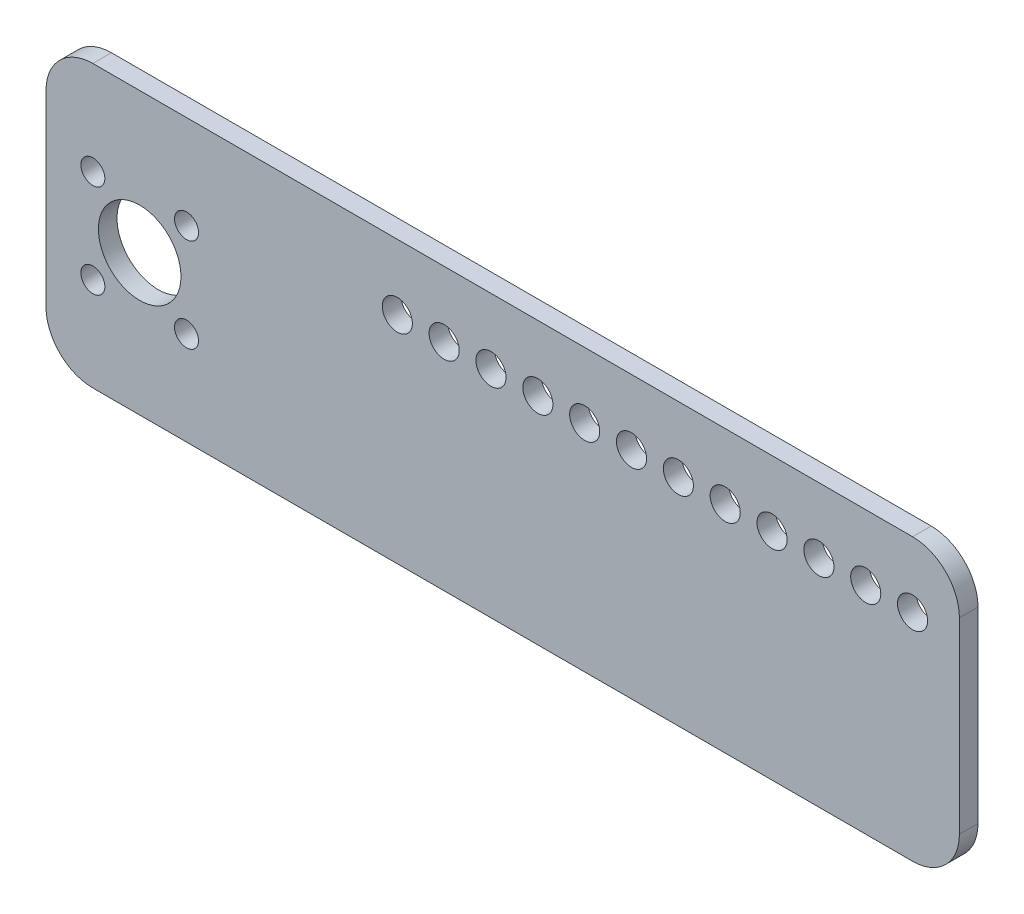
ISO-10303-21;
HEADER;
FILE_DESCRIPTION(('STEP AP214'),'2;1');
FILE_NAME('part.step','',(''),(''),'','','');
FILE_SCHEMA(('AUTOMOTIVE_DESIGN { 1 0 10303 214 1 1 1 1 }'));
ENDSEC;
DATA;
#1=APPLICATION_CONTEXT('core data for automotive mechanical design processes');
#2=APPLICATION_PROTOCOL_DEFINITION('international standard','automotive_design',2000,#1);
#3=PRODUCT_CONTEXT('',#1,'mechanical');
#4=PRODUCT('Part','Part','',(#3));
#5=PRODUCT_RELATED_PRODUCT_CATEGORY('part','',(#4));
#6=PRODUCT_DEFINITION_FORMATION('','',#4);
#7=PRODUCT_DEFINITION_CONTEXT('part definition',#1,'design');
#8=PRODUCT_DEFINITION('design','',#6,#7);
#9=PRODUCT_DEFINITION_SHAPE('','',#8);
#10=(LENGTH_UNIT() NAMED_UNIT(*) SI_UNIT(.MILLI.,.METRE.));
#11=(NAMED_UNIT(*) PLANE_ANGLE_UNIT() SI_UNIT($,.RADIAN.));
#12=(NAMED_UNIT(*) SI_UNIT($,.STERADIAN.) SOLID_ANGLE_UNIT());
#13=UNCERTAINTY_MEASURE_WITH_UNIT(LENGTH_MEASURE(1.E-05),#10,'distance_accuracy_value','');
#14=(GEOMETRIC_REPRESENTATION_CONTEXT(3) GLOBAL_UNCERTAINTY_ASSIGNED_CONTEXT((#13)) GLOBAL_UNIT_ASSIGNED_CONTEXT((#10,
#11,#12)) REPRESENTATION_CONTEXT('',''));
#15=CARTESIAN_POINT('',(0.,0.,0.));
#16=DIRECTION('',(0.,0.,1.));
#17=DIRECTION('',(1.,0.,0.));
#18=AXIS2_PLACEMENT_3D('',#15,#16,#17);
#19=CARTESIAN_POINT('',(0.,24.,3.175));
#20=DIRECTION('',(0.,-1.,0.));
#21=DIRECTION('',(1.,0.,0.));
#22=AXIS2_PLACEMENT_3D('',#19,#20,#21);
#23=PLANE('',#22);
#24=DIRECTION('',(-1.,0.,0.));
#25=VECTOR('',#24,1.);
#26=CARTESIAN_POINT('',(0.,24.,3.175));
#27=LINE('',#26,#25);
#28=CARTESIAN_POINT('',(70.,24.,3.175));
#29=VERTEX_POINT('',#28);
#30=CARTESIAN_POINT('',(-70.,24.,3.175));
#31=VERTEX_POINT('',#30);
#32=EDGE_CURVE('E230',#29,#31,#27,.T.);
#33=ORIENTED_EDGE('',*,*,#32,.F.);
#34=DIRECTION('',(0.,0.,-1.));
#35=VECTOR('',#34,1.);
#36=CARTESIAN_POINT('',(70.,24.,0.));
#37=LINE('',#36,#35);
#38=CARTESIAN_POINT('',(70.,24.,0.));
#39=VERTEX_POINT('',#38);
#40=EDGE_CURVE('E153',#29,#39,#37,.T.);
#41=ORIENTED_EDGE('',*,*,#40,.T.);
#42=DIRECTION('',(-1.,0.,0.));
#43=VECTOR('',#42,1.);
#44=CARTESIAN_POINT('',(0.,24.,0.));
#45=LINE('',#44,#43);
#46=CARTESIAN_POINT('',(-70.,24.,0.));
#47=VERTEX_POINT('',#46);
#48=EDGE_CURVE('E107',#39,#47,#45,.T.);
#49=ORIENTED_EDGE('',*,*,#48,.T.);
#50=DIRECTION('',(0.,0.,-1.));
#51=VECTOR('',#50,1.);
#52=CARTESIAN_POINT('',(-70.,24.,3.175));
#53=LINE('',#52,#51);
#54=EDGE_CURVE('E151',#47,#31,#53,.F.);
#55=ORIENTED_EDGE('',*,*,#54,.T.);
#56=EDGE_LOOP('',(#33,#41,#49,#55));
#57=FACE_BOUND('',#56,.T.);
#58=ADVANCED_FACE('F35',(#57),#23,.F.);
#59=CARTESIAN_POINT('',(-78.,0.,3.175));
#60=DIRECTION('',(1.,0.,0.));
#61=DIRECTION('',(0.,1.,0.));
#62=AXIS2_PLACEMENT_3D('',#59,#60,#61);
#63=PLANE('',#62);
#64=DIRECTION('',(0.,-1.,0.));
#65=VECTOR('',#64,1.);
#66=CARTESIAN_POINT('',(-78.,0.,0.));
#67=LINE('',#66,#65);
#68=CARTESIAN_POINT('',(-78.,16.,0.));
#69=VERTEX_POINT('',#68);
#70=CARTESIAN_POINT('',(-78.,-16.,0.));
#71=VERTEX_POINT('',#70);
#72=EDGE_CURVE('E214',#69,#71,#67,.T.);
#73=ORIENTED_EDGE('',*,*,#72,.T.);
#74=DIRECTION('',(0.,0.,-1.));
#75=VECTOR('',#74,1.);
#76=CARTESIAN_POINT('',(-78.,-16.,3.175));
#77=LINE('',#76,#75);
#78=CARTESIAN_POINT('',(-78.,-16.,3.175));
#79=VERTEX_POINT('',#78);
#80=EDGE_CURVE('E11',#71,#79,#77,.F.);
#81=ORIENTED_EDGE('',*,*,#80,.T.);
#82=DIRECTION('',(0.,-1.,0.));
#83=VECTOR('',#82,1.);
#84=CARTESIAN_POINT('',(-78.,0.,3.175));
#85=LINE('',#84,#83);
#86=CARTESIAN_POINT('',(-78.,16.,3.175));
#87=VERTEX_POINT('',#86);
#88=EDGE_CURVE('E229',#87,#79,#85,.T.);
#89=ORIENTED_EDGE('',*,*,#88,.F.);
#90=DIRECTION('',(0.,0.,-1.));
#91=VECTOR('',#90,1.);
#92=CARTESIAN_POINT('',(-78.,16.,3.175));
#93=LINE('',#92,#91);
#94=EDGE_CURVE('E44',#87,#69,#93,.T.);
#95=ORIENTED_EDGE('',*,*,#94,.T.);
#96=EDGE_LOOP('',(#73,#81,#89,#95));
#97=FACE_BOUND('',#96,.T.);
#98=ADVANCED_FACE('F337',(#97),#63,.F.);
#99=CARTESIAN_POINT('',(0.,-24.,3.175));
#100=DIRECTION('',(0.,-1.,0.));
#101=DIRECTION('',(1.,0.,0.));
#102=AXIS2_PLACEMENT_3D('',#99,#100,#101);
#103=PLANE('',#102);
#104=DIRECTION('',(-1.,0.,0.));
#105=VECTOR('',#104,1.);
#106=CARTESIAN_POINT('',(0.,-24.,0.));
#107=LINE('',#106,#105);
#108=CARTESIAN_POINT('',(70.,-24.,0.));
#109=VERTEX_POINT('',#108);
#110=CARTESIAN_POINT('',(-70.,-24.,0.));
#111=VERTEX_POINT('',#110);
#112=EDGE_CURVE('E124',#109,#111,#107,.T.);
#113=ORIENTED_EDGE('',*,*,#112,.F.);
#114=DIRECTION('',(0.,0.,-1.));
#115=VECTOR('',#114,1.);
#116=CARTESIAN_POINT('',(70.,-24.,3.175));
#117=LINE('',#116,#115);
#118=CARTESIAN_POINT('',(70.,-24.,3.175));
#119=VERTEX_POINT('',#118);
#120=EDGE_CURVE('E143',#109,#119,#117,.F.);
#121=ORIENTED_EDGE('',*,*,#120,.T.);
#122=DIRECTION('',(-1.,0.,0.));
#123=VECTOR('',#122,1.);
#124=CARTESIAN_POINT('',(0.,-24.,3.175));
#125=LINE('',#124,#123);
#126=CARTESIAN_POINT('',(-70.,-24.,3.175));
#127=VERTEX_POINT('',#126);
#128=EDGE_CURVE('E133',#119,#127,#125,.T.);
#129=ORIENTED_EDGE('',*,*,#128,.T.);
#130=DIRECTION('',(0.,0.,-1.));
#131=VECTOR('',#130,1.);
#132=CARTESIAN_POINT('',(-70.,-24.,0.));
#133=LINE('',#132,#131);
#134=EDGE_CURVE('E140',#127,#111,#133,.T.);
#135=ORIENTED_EDGE('',*,*,#134,.T.);
#136=EDGE_LOOP('',(#113,#121,#129,#135));
#137=FACE_BOUND('',#136,.T.);
#138=ADVANCED_FACE('F220',(#137),#103,.T.);
#139=CARTESIAN_POINT('',(-69.9999999999337,7.99999999999999,3.175));
#140=DIRECTION('',(0.,0.,-1.));
#141=DIRECTION('',(-1.,0.,0.));
#142=AXIS2_PLACEMENT_3D('',#139,#140,#141);
#143=CYLINDRICAL_SURFACE('',#142,2.04999999999999);
#144=CARTESIAN_POINT('',(-69.9999999999337,7.99999999999999,3.175));
#145=DIRECTION('',(0.,0.,1.));
#146=DIRECTION('',(1.,0.,0.));
#147=AXIS2_PLACEMENT_3D('',#144,#145,#146);
#148=CIRCLE('',#147,2.04999999999999);
#149=CARTESIAN_POINT('',(-67.9499999999337,7.99999999999999,3.175));
#150=VERTEX_POINT('',#149);
#151=EDGE_CURVE('E234',#150,#150,#148,.T.);
#152=ORIENTED_EDGE('',*,*,#151,.T.);
#153=EDGE_LOOP('',(#152));
#154=FACE_BOUND('',#153,.T.);
#155=CARTESIAN_POINT('',(-69.9999999999337,7.99999999999999,0.));
#156=DIRECTION('',(0.,0.,1.));
#157=DIRECTION('',(1.,0.,0.));
#158=AXIS2_PLACEMENT_3D('',#155,#156,#157);
#159=CIRCLE('',#158,2.04999999999999);
#160=CARTESIAN_POINT('',(-67.9499999999337,7.99999999999999,0.));
#161=VERTEX_POINT('',#160);
#162=EDGE_CURVE('E210',#161,#161,#159,.T.);
#163=ORIENTED_EDGE('',*,*,#162,.F.);
#164=EDGE_LOOP('',(#163));
#165=FACE_BOUND('',#164,.T.);
#166=ADVANCED_FACE('F322',(#154,#165),#143,.F.);
#167=CARTESIAN_POINT('',(-53.9999999999337,7.99999999999999,3.175));
#168=DIRECTION('',(0.,0.,-1.));
#169=DIRECTION('',(-1.,0.,0.));
#170=AXIS2_PLACEMENT_3D('',#167,#168,#169);
#171=CYLINDRICAL_SURFACE('',#170,2.04999999999999);
#172=CARTESIAN_POINT('',(-53.9999999999337,7.99999999999999,3.175));
#173=DIRECTION('',(0.,0.,1.));
#174=DIRECTION('',(1.,0.,0.));
#175=AXIS2_PLACEMENT_3D('',#172,#173,#174);
#176=CIRCLE('',#175,2.04999999999999);
#177=CARTESIAN_POINT('',(-51.9499999999337,7.99999999999999,3.175));
#178=VERTEX_POINT('',#177);
#179=EDGE_CURVE('E237',#178,#178,#176,.T.);
#180=ORIENTED_EDGE('',*,*,#179,.T.);
#181=EDGE_LOOP('',(#180));
#182=FACE_BOUND('',#181,.T.);
#183=CARTESIAN_POINT('',(-53.9999999999337,7.99999999999999,0.));
#184=DIRECTION('',(0.,0.,1.));
#185=DIRECTION('',(1.,0.,0.));
#186=AXIS2_PLACEMENT_3D('',#183,#184,#185);
#187=CIRCLE('',#186,2.04999999999999);
#188=CARTESIAN_POINT('',(-51.9499999999337,7.99999999999999,0.));
#189=VERTEX_POINT('',#188);
#190=EDGE_CURVE('E207',#189,#189,#187,.T.);
#191=ORIENTED_EDGE('',*,*,#190,.F.);
#192=EDGE_LOOP('',(#191));
#193=FACE_BOUND('',#192,.T.);
#194=ADVANCED_FACE('F325',(#182,#193),#171,.F.);
#195=CARTESIAN_POINT('',(-53.9999999999337,-8.00000000000001,3.175));
#196=DIRECTION('',(0.,0.,-1.));
#197=DIRECTION('',(-1.,0.,0.));
#198=AXIS2_PLACEMENT_3D('',#195,#196,#197);
#199=CYLINDRICAL_SURFACE('',#198,2.04999999999999);
#200=CARTESIAN_POINT('',(-53.9999999999337,-8.00000000000001,3.175));
#201=DIRECTION('',(0.,0.,1.));
#202=DIRECTION('',(1.,0.,0.));
#203=AXIS2_PLACEMENT_3D('',#200,#201,#202);
#204=CIRCLE('',#203,2.04999999999999);
#205=CARTESIAN_POINT('',(-51.9499999999337,-8.00000000000001,3.175));
#206=VERTEX_POINT('',#205);
#207=EDGE_CURVE('E240',#206,#206,#204,.T.);
#208=ORIENTED_EDGE('',*,*,#207,.T.);
#209=EDGE_LOOP('',(#208));
#210=FACE_BOUND('',#209,.T.);
#211=CARTESIAN_POINT('',(-53.9999999999337,-8.00000000000001,0.));
#212=DIRECTION('',(0.,0.,1.));
#213=DIRECTION('',(1.,0.,0.));
#214=AXIS2_PLACEMENT_3D('',#211,#212,#213);
#215=CIRCLE('',#214,2.04999999999999);
#216=CARTESIAN_POINT('',(-51.9499999999337,-8.00000000000001,0.));
#217=VERTEX_POINT('',#216);
#218=EDGE_CURVE('E201',#217,#217,#215,.T.);
#219=ORIENTED_EDGE('',*,*,#218,.F.);
#220=EDGE_LOOP('',(#219));
#221=FACE_BOUND('',#220,.T.);
#222=ADVANCED_FACE('F349',(#210,#221),#199,.F.);
#223=CARTESIAN_POINT('',(-69.9999999999337,-8.00000000000001,3.175));
#224=DIRECTION('',(0.,0.,-1.));
#225=DIRECTION('',(-1.,0.,0.));
#226=AXIS2_PLACEMENT_3D('',#223,#224,#225);
#227=CYLINDRICAL_SURFACE('',#226,2.04999999999999);
#228=CARTESIAN_POINT('',(-69.9999999999337,-8.00000000000001,3.175));
#229=DIRECTION('',(0.,0.,1.));
#230=DIRECTION('',(1.,0.,0.));
#231=AXIS2_PLACEMENT_3D('',#228,#229,#230);
#232=CIRCLE('',#231,2.04999999999999);
#233=CARTESIAN_POINT('',(-67.9499999999337,-8.00000000000001,3.175));
#234=VERTEX_POINT('',#233);
#235=EDGE_CURVE('E243',#234,#234,#232,.T.);
#236=ORIENTED_EDGE('',*,*,#235,.T.);
#237=EDGE_LOOP('',(#236));
#238=FACE_BOUND('',#237,.T.);
#239=CARTESIAN_POINT('',(-69.9999999999337,-8.00000000000001,0.));
#240=DIRECTION('',(0.,0.,1.));
#241=DIRECTION('',(1.,0.,0.));
#242=AXIS2_PLACEMENT_3D('',#239,#240,#241);
#243=CIRCLE('',#242,2.04999999999999);
#244=CARTESIAN_POINT('',(-67.9499999999337,-8.00000000000001,0.));
#245=VERTEX_POINT('',#244);
#246=EDGE_CURVE('E196',#245,#245,#243,.T.);
#247=ORIENTED_EDGE('',*,*,#246,.F.);
#248=EDGE_LOOP('',(#247));
#249=FACE_BOUND('',#248,.T.);
#250=ADVANCED_FACE('F353',(#238,#249),#227,.F.);
#251=CARTESIAN_POINT('',(-61.9999999999337,0.,3.175));
#252=DIRECTION('',(0.,0.,-1.));
#253=DIRECTION('',(-1.,0.,0.));
#254=AXIS2_PLACEMENT_3D('',#251,#252,#253);
#255=CYLINDRICAL_SURFACE('',#254,7.05);
#256=CARTESIAN_POINT('',(-61.9999999999337,0.,3.175));
#257=DIRECTION('',(0.,0.,1.));
#258=DIRECTION('',(1.,0.,0.));
#259=AXIS2_PLACEMENT_3D('',#256,#257,#258);
#260=CIRCLE('',#259,7.05);
#261=CARTESIAN_POINT('',(-54.9499999999337,0.,3.175));
#262=VERTEX_POINT('',#261);
#263=EDGE_CURVE('E123',#262,#262,#260,.T.);
#264=ORIENTED_EDGE('',*,*,#263,.T.);
#265=EDGE_LOOP('',(#264));
#266=FACE_BOUND('',#265,.T.);
#267=CARTESIAN_POINT('',(-61.9999999999337,0.,0.));
#268=DIRECTION('',(0.,0.,1.));
#269=DIRECTION('',(1.,0.,0.));
#270=AXIS2_PLACEMENT_3D('',#267,#268,#269);
#271=CIRCLE('',#270,7.05);
#272=CARTESIAN_POINT('',(-54.9499999999337,0.,0.));
#273=VERTEX_POINT('',#272);
#274=EDGE_CURVE('E192',#273,#273,#271,.T.);
#275=ORIENTED_EDGE('',*,*,#274,.F.);
#276=EDGE_LOOP('',(#275));
#277=FACE_BOUND('',#276,.T.);
#278=ADVANCED_FACE('F357',(#266,#277),#255,.F.);
#279=CARTESIAN_POINT('',(78.,0.,3.175));
#280=DIRECTION('',(1.,0.,0.));
#281=DIRECTION('',(0.,0.,-1.));
#282=AXIS2_PLACEMENT_3D('',#279,#280,#281);
#283=PLANE('',#282);
#284=DIRECTION('',(0.,-1.,0.));
#285=VECTOR('',#284,1.);
#286=CARTESIAN_POINT('',(78.,0.,3.175));
#287=LINE('',#286,#285);
#288=CARTESIAN_POINT('',(78.,16.,3.175));
#289=VERTEX_POINT('',#288);
#290=CARTESIAN_POINT('',(78.,-16.,3.175));
#291=VERTEX_POINT('',#290);
#292=EDGE_CURVE('E129',#289,#291,#287,.T.);
#293=ORIENTED_EDGE('',*,*,#292,.T.);
#294=DIRECTION('',(0.,0.,-1.));
#295=VECTOR('',#294,1.);
#296=CARTESIAN_POINT('',(78.,-16.,3.175));
#297=LINE('',#296,#295);
#298=CARTESIAN_POINT('',(78.,-16.,0.));
#299=VERTEX_POINT('',#298);
#300=EDGE_CURVE('E122',#291,#299,#297,.T.);
#301=ORIENTED_EDGE('',*,*,#300,.T.);
#302=DIRECTION('',(0.,-1.,0.));
#303=VECTOR('',#302,1.);
#304=CARTESIAN_POINT('',(78.,0.,0.));
#305=LINE('',#304,#303);
#306=CARTESIAN_POINT('',(78.,16.,0.));
#307=VERTEX_POINT('',#306);
#308=EDGE_CURVE('E105',#307,#299,#305,.T.);
#309=ORIENTED_EDGE('',*,*,#308,.F.);
#310=DIRECTION('',(0.,0.,-1.));
#311=VECTOR('',#310,1.);
#312=CARTESIAN_POINT('',(78.,16.,3.175));
#313=LINE('',#312,#311);
#314=EDGE_CURVE('E119',#307,#289,#313,.F.);
#315=ORIENTED_EDGE('',*,*,#314,.T.);
#316=EDGE_LOOP('',(#293,#301,#309,#315));
#317=FACE_BOUND('',#316,.T.);
#318=ADVANCED_FACE('F118',(#317),#283,.T.);
#319=CARTESIAN_POINT('',(0.,0.,3.175));
#320=DIRECTION('',(0.,0.,1.));
#321=DIRECTION('',(1.,0.,0.));
#322=AXIS2_PLACEMENT_3D('',#319,#320,#321);
#323=PLANE('',#322);
#324=CARTESIAN_POINT('',(70.,12.825,3.175));
#325=DIRECTION('',(0.,0.,1.));
#326=DIRECTION('',(1.,0.,0.));
#327=AXIS2_PLACEMENT_3D('',#324,#325,#326);
#328=CIRCLE('',#327,2.57171764329156);
#329=CARTESIAN_POINT('',(72.5717176432916,12.825,3.175));
#330=VERTEX_POINT('',#329);
#331=EDGE_CURVE('E161',#330,#330,#328,.T.);
#332=ORIENTED_EDGE('',*,*,#331,.F.);
#333=EDGE_LOOP('',(#332));
#334=FACE_BOUND('',#333,.T.);
#335=CARTESIAN_POINT('',(62.,12.825,3.175));
#336=DIRECTION('',(0.,0.,1.));
#337=DIRECTION('',(1.,0.,0.));
#338=AXIS2_PLACEMENT_3D('',#335,#336,#337);
#339=CIRCLE('',#338,2.57171764329157);
#340=CARTESIAN_POINT('',(64.5717176432916,12.825,3.175));
#341=VERTEX_POINT('',#340);
#342=EDGE_CURVE('E278',#341,#341,#339,.T.);
#343=ORIENTED_EDGE('',*,*,#342,.F.);
#344=EDGE_LOOP('',(#343));
#345=FACE_BOUND('',#344,.T.);
#346=CARTESIAN_POINT('',(54.,12.8249999999999,3.175));
#347=DIRECTION('',(0.,0.,1.));
#348=DIRECTION('',(1.,0.,0.));
#349=AXIS2_PLACEMENT_3D('',#346,#347,#348);
#350=CIRCLE('',#349,2.57171764329156);
#351=CARTESIAN_POINT('',(56.5717176432916,12.8249999999999,3.175));
#352=VERTEX_POINT('',#351);
#353=EDGE_CURVE('E275',#352,#352,#350,.T.);
#354=ORIENTED_EDGE('',*,*,#353,.F.);
#355=EDGE_LOOP('',(#354));
#356=FACE_BOUND('',#355,.T.);
#357=CARTESIAN_POINT('',(46.,12.8249999999998,3.175));
#358=DIRECTION('',(0.,0.,1.));
#359=DIRECTION('',(1.,0.,0.));
#360=AXIS2_PLACEMENT_3D('',#357,#358,#359);
#361=CIRCLE('',#360,2.57171764329156);
#362=CARTESIAN_POINT('',(48.5717176432916,12.8249999999998,3.175));
#363=VERTEX_POINT('',#362);
#364=EDGE_CURVE('E272',#363,#363,#361,.T.);
#365=ORIENTED_EDGE('',*,*,#364,.F.);
#366=EDGE_LOOP('',(#365));
#367=FACE_BOUND('',#366,.T.);
#368=CARTESIAN_POINT('',(38.,12.8249999999998,3.175));
#369=DIRECTION('',(0.,0.,1.));
#370=DIRECTION('',(1.,0.,0.));
#371=AXIS2_PLACEMENT_3D('',#368,#369,#370);
#372=CIRCLE('',#371,2.57171764329156);
#373=CARTESIAN_POINT('',(40.5717176432916,12.8249999999998,3.175));
#374=VERTEX_POINT('',#373);
#375=EDGE_CURVE('E269',#374,#374,#372,.T.);
#376=ORIENTED_EDGE('',*,*,#375,.F.);
#377=EDGE_LOOP('',(#376));
#378=FACE_BOUND('',#377,.T.);
#379=CARTESIAN_POINT('',(30.,12.8249999999997,3.175));
#380=DIRECTION('',(0.,0.,1.));
#381=DIRECTION('',(1.,0.,0.));
#382=AXIS2_PLACEMENT_3D('',#379,#380,#381);
#383=CIRCLE('',#382,2.57171764329156);
#384=CARTESIAN_POINT('',(32.5717176432916,12.8249999999997,3.175));
#385=VERTEX_POINT('',#384);
#386=EDGE_CURVE('E266',#385,#385,#383,.T.);
#387=ORIENTED_EDGE('',*,*,#386,.F.);
#388=EDGE_LOOP('',(#387));
#389=FACE_BOUND('',#388,.T.);
#390=CARTESIAN_POINT('',(22.,12.8249999999997,3.175));
#391=DIRECTION('',(0.,0.,1.));
#392=DIRECTION('',(1.,0.,0.));
#393=AXIS2_PLACEMENT_3D('',#390,#391,#392);
#394=CIRCLE('',#393,2.57171764329156);
#395=CARTESIAN_POINT('',(24.5717176432916,12.8249999999997,3.175));
#396=VERTEX_POINT('',#395);
#397=EDGE_CURVE('E263',#396,#396,#394,.T.);
#398=ORIENTED_EDGE('',*,*,#397,.F.);
#399=EDGE_LOOP('',(#398));
#400=FACE_BOUND('',#399,.T.);
#401=CARTESIAN_POINT('',(14.,12.8249999999996,3.175));
#402=DIRECTION('',(0.,0.,1.));
#403=DIRECTION('',(1.,0.,0.));
#404=AXIS2_PLACEMENT_3D('',#401,#402,#403);
#405=CIRCLE('',#404,2.57171764329156);
#406=CARTESIAN_POINT('',(16.5717176432916,12.8249999999996,3.175));
#407=VERTEX_POINT('',#406);
#408=EDGE_CURVE('E260',#407,#407,#405,.T.);
#409=ORIENTED_EDGE('',*,*,#408,.F.);
#410=EDGE_LOOP('',(#409));
#411=FACE_BOUND('',#410,.T.);
#412=CARTESIAN_POINT('',(6.00000000000003,12.8249999999996,3.175));
#413=DIRECTION('',(0.,0.,1.));
#414=DIRECTION('',(1.,0.,0.));
#415=AXIS2_PLACEMENT_3D('',#412,#413,#414);
#416=CIRCLE('',#415,2.57171764329156);
#417=CARTESIAN_POINT('',(8.5717176432916,12.8249999999996,3.175));
#418=VERTEX_POINT('',#417);
#419=EDGE_CURVE('E257',#418,#418,#416,.T.);
#420=ORIENTED_EDGE('',*,*,#419,.F.);
#421=EDGE_LOOP('',(#420));
#422=FACE_BOUND('',#421,.T.);
#423=CARTESIAN_POINT('',(-1.99999999999997,12.8249999999995,3.175));
#424=DIRECTION('',(0.,0.,1.));
#425=DIRECTION('',(1.,0.,0.));
#426=AXIS2_PLACEMENT_3D('',#423,#424,#425);
#427=CIRCLE('',#426,2.57171764329156);
#428=CARTESIAN_POINT('',(0.571717643291588,12.8249999999995,3.175));
#429=VERTEX_POINT('',#428);
#430=EDGE_CURVE('E254',#429,#429,#427,.T.);
#431=ORIENTED_EDGE('',*,*,#430,.F.);
#432=EDGE_LOOP('',(#431));
#433=FACE_BOUND('',#432,.T.);
#434=CARTESIAN_POINT('',(-9.99999999999997,12.8249999999994,3.175));
#435=DIRECTION('',(0.,0.,1.));
#436=DIRECTION('',(1.,0.,0.));
#437=AXIS2_PLACEMENT_3D('',#434,#435,#436);
#438=CIRCLE('',#437,2.57171764329156);
#439=CARTESIAN_POINT('',(-7.42828235670841,12.8249999999994,3.175));
#440=VERTEX_POINT('',#439);
#441=EDGE_CURVE('E251',#440,#440,#438,.T.);
#442=ORIENTED_EDGE('',*,*,#441,.F.);
#443=EDGE_LOOP('',(#442));
#444=FACE_BOUND('',#443,.T.);
#445=CARTESIAN_POINT('',(-18.,12.8249999999994,3.175));
#446=DIRECTION('',(0.,0.,1.));
#447=DIRECTION('',(1.,0.,0.));
#448=AXIS2_PLACEMENT_3D('',#445,#446,#447);
#449=CIRCLE('',#448,2.57171764329156);
#450=CARTESIAN_POINT('',(-15.4282823567084,12.8249999999994,3.175));
#451=VERTEX_POINT('',#450);
#452=EDGE_CURVE('E248',#451,#451,#449,.T.);
#453=ORIENTED_EDGE('',*,*,#452,.F.);
#454=EDGE_LOOP('',(#453));
#455=FACE_BOUND('',#454,.T.);
#456=ORIENTED_EDGE('',*,*,#263,.F.);
#457=EDGE_LOOP('',(#456));
#458=FACE_BOUND('',#457,.T.);
#459=ORIENTED_EDGE('',*,*,#235,.F.);
#460=EDGE_LOOP('',(#459));
#461=FACE_BOUND('',#460,.T.);
#462=ORIENTED_EDGE('',*,*,#207,.F.);
#463=EDGE_LOOP('',(#462));
#464=FACE_BOUND('',#463,.T.);
#465=ORIENTED_EDGE('',*,*,#179,.F.);
#466=EDGE_LOOP('',(#465));
#467=FACE_BOUND('',#466,.T.);
#468=ORIENTED_EDGE('',*,*,#151,.F.);
#469=EDGE_LOOP('',(#468));
#470=FACE_BOUND('',#469,.T.);
#471=ORIENTED_EDGE('',*,*,#128,.F.);
#472=CARTESIAN_POINT('',(70.,-16.,3.175));
#473=DIRECTION('',(0.,0.,1.));
#474=DIRECTION('',(1.,0.,0.));
#475=AXIS2_PLACEMENT_3D('',#472,#473,#474);
#476=CIRCLE('',#475,8.);
#477=EDGE_CURVE('E149',#119,#291,#476,.T.);
#478=ORIENTED_EDGE('',*,*,#477,.T.);
#479=ORIENTED_EDGE('',*,*,#292,.F.);
#480=CARTESIAN_POINT('',(70.,16.,3.175));
#481=DIRECTION('',(0.,0.,1.));
#482=DIRECTION('',(1.,0.,0.));
#483=AXIS2_PLACEMENT_3D('',#480,#481,#482);
#484=CIRCLE('',#483,8.);
#485=EDGE_CURVE('E128',#289,#29,#484,.T.);
#486=ORIENTED_EDGE('',*,*,#485,.T.);
#487=ORIENTED_EDGE('',*,*,#32,.T.);
#488=CARTESIAN_POINT('',(-70.,16.,3.175));
#489=DIRECTION('',(0.,0.,1.));
#490=DIRECTION('',(1.,0.,0.));
#491=AXIS2_PLACEMENT_3D('',#488,#489,#490);
#492=CIRCLE('',#491,8.);
#493=EDGE_CURVE('E57',#31,#87,#492,.T.);
#494=ORIENTED_EDGE('',*,*,#493,.T.);
#495=ORIENTED_EDGE('',*,*,#88,.T.);
#496=CARTESIAN_POINT('',(-70.,-16.,3.175));
#497=DIRECTION('',(0.,0.,1.));
#498=DIRECTION('',(1.,0.,0.));
#499=AXIS2_PLACEMENT_3D('',#496,#497,#498);
#500=CIRCLE('',#499,8.);
#501=EDGE_CURVE('E146',#79,#127,#500,.T.);
#502=ORIENTED_EDGE('',*,*,#501,.T.);
#503=EDGE_LOOP('',(#471,#478,#479,#486,#487,#494,#495,#502));
#504=FACE_BOUND('',#503,.T.);
#505=ADVANCED_FACE('F227',(#334,#345,#356,#367,#378,#389,#400,#411,#422,#433,#444,#455,#458,
#461,#464,#467,#470,#504),#323,.T.);
#506=CARTESIAN_POINT('',(0.,0.,0.));
#507=DIRECTION('',(0.,0.,1.));
#508=DIRECTION('',(1.,0.,0.));
#509=AXIS2_PLACEMENT_3D('',#506,#507,#508);
#510=PLANE('',#509);
#511=CARTESIAN_POINT('',(70.,12.825,0.));
#512=DIRECTION('',(0.,0.,1.));
#513=DIRECTION('',(1.,0.,0.));
#514=AXIS2_PLACEMENT_3D('',#511,#512,#513);
#515=CIRCLE('',#514,2.57171764329156);
#516=CARTESIAN_POINT('',(72.5717176432916,12.825,0.));
#517=VERTEX_POINT('',#516);
#518=EDGE_CURVE('E39',#517,#517,#515,.T.);
#519=ORIENTED_EDGE('',*,*,#518,.T.);
#520=EDGE_LOOP('',(#519));
#521=FACE_BOUND('',#520,.T.);
#522=CARTESIAN_POINT('',(62.,12.825,0.));
#523=DIRECTION('',(0.,0.,1.));
#524=DIRECTION('',(1.,0.,0.));
#525=AXIS2_PLACEMENT_3D('',#522,#523,#524);
#526=CIRCLE('',#525,2.57171764329157);
#527=CARTESIAN_POINT('',(64.5717176432916,12.825,0.));
#528=VERTEX_POINT('',#527);
#529=EDGE_CURVE('E187',#528,#528,#526,.T.);
#530=ORIENTED_EDGE('',*,*,#529,.T.);
#531=EDGE_LOOP('',(#530));
#532=FACE_BOUND('',#531,.T.);
#533=CARTESIAN_POINT('',(54.,12.8249999999999,0.));
#534=DIRECTION('',(0.,0.,1.));
#535=DIRECTION('',(1.,0.,0.));
#536=AXIS2_PLACEMENT_3D('',#533,#534,#535);
#537=CIRCLE('',#536,2.57171764329156);
#538=CARTESIAN_POINT('',(56.5717176432916,12.8249999999999,0.));
#539=VERTEX_POINT('',#538);
#540=EDGE_CURVE('E185',#539,#539,#537,.T.);
#541=ORIENTED_EDGE('',*,*,#540,.T.);
#542=EDGE_LOOP('',(#541));
#543=FACE_BOUND('',#542,.T.);
#544=CARTESIAN_POINT('',(46.,12.8249999999998,0.));
#545=DIRECTION('',(0.,0.,1.));
#546=DIRECTION('',(1.,0.,0.));
#547=AXIS2_PLACEMENT_3D('',#544,#545,#546);
#548=CIRCLE('',#547,2.57171764329156);
#549=CARTESIAN_POINT('',(48.5717176432916,12.8249999999998,0.));
#550=VERTEX_POINT('',#549);
#551=EDGE_CURVE('E182',#550,#550,#548,.T.);
#552=ORIENTED_EDGE('',*,*,#551,.T.);
#553=EDGE_LOOP('',(#552));
#554=FACE_BOUND('',#553,.T.);
#555=CARTESIAN_POINT('',(38.,12.8249999999998,0.));
#556=DIRECTION('',(0.,0.,1.));
#557=DIRECTION('',(1.,0.,0.));
#558=AXIS2_PLACEMENT_3D('',#555,#556,#557);
#559=CIRCLE('',#558,2.57171764329156);
#560=CARTESIAN_POINT('',(40.5717176432916,12.8249999999998,0.));
#561=VERTEX_POINT('',#560);
#562=EDGE_CURVE('E179',#561,#561,#559,.T.);
#563=ORIENTED_EDGE('',*,*,#562,.T.);
#564=EDGE_LOOP('',(#563));
#565=FACE_BOUND('',#564,.T.);
#566=CARTESIAN_POINT('',(30.,12.8249999999997,0.));
#567=DIRECTION('',(0.,0.,1.));
#568=DIRECTION('',(1.,0.,0.));
#569=AXIS2_PLACEMENT_3D('',#566,#567,#568);
#570=CIRCLE('',#569,2.57171764329156);
#571=CARTESIAN_POINT('',(32.5717176432916,12.8249999999997,0.));
#572=VERTEX_POINT('',#571);
#573=EDGE_CURVE('E176',#572,#572,#570,.T.);
#574=ORIENTED_EDGE('',*,*,#573,.T.);
#575=EDGE_LOOP('',(#574));
#576=FACE_BOUND('',#575,.T.);
#577=CARTESIAN_POINT('',(22.,12.8249999999997,0.));
#578=DIRECTION('',(0.,0.,1.));
#579=DIRECTION('',(1.,0.,0.));
#580=AXIS2_PLACEMENT_3D('',#577,#578,#579);
#581=CIRCLE('',#580,2.57171764329156);
#582=CARTESIAN_POINT('',(24.5717176432916,12.8249999999997,0.));
#583=VERTEX_POINT('',#582);
#584=EDGE_CURVE('E173',#583,#583,#581,.T.);
#585=ORIENTED_EDGE('',*,*,#584,.T.);
#586=EDGE_LOOP('',(#585));
#587=FACE_BOUND('',#586,.T.);
#588=CARTESIAN_POINT('',(14.,12.8249999999996,0.));
#589=DIRECTION('',(0.,0.,1.));
#590=DIRECTION('',(1.,0.,0.));
#591=AXIS2_PLACEMENT_3D('',#588,#589,#590);
#592=CIRCLE('',#591,2.57171764329156);
#593=CARTESIAN_POINT('',(16.5717176432916,12.8249999999996,0.));
#594=VERTEX_POINT('',#593);
#595=EDGE_CURVE('E170',#594,#594,#592,.T.);
#596=ORIENTED_EDGE('',*,*,#595,.T.);
#597=EDGE_LOOP('',(#596));
#598=FACE_BOUND('',#597,.T.);
#599=CARTESIAN_POINT('',(6.00000000000003,12.8249999999996,0.));
#600=DIRECTION('',(0.,0.,1.));
#601=DIRECTION('',(1.,0.,0.));
#602=AXIS2_PLACEMENT_3D('',#599,#600,#601);
#603=CIRCLE('',#602,2.57171764329156);
#604=CARTESIAN_POINT('',(8.5717176432916,12.8249999999996,0.));
#605=VERTEX_POINT('',#604);
#606=EDGE_CURVE('E167',#605,#605,#603,.T.);
#607=ORIENTED_EDGE('',*,*,#606,.T.);
#608=EDGE_LOOP('',(#607));
#609=FACE_BOUND('',#608,.T.);
#610=CARTESIAN_POINT('',(-1.99999999999997,12.8249999999995,0.));
#611=DIRECTION('',(0.,0.,1.));
#612=DIRECTION('',(1.,0.,0.));
#613=AXIS2_PLACEMENT_3D('',#610,#611,#612);
#614=CIRCLE('',#613,2.57171764329156);
#615=CARTESIAN_POINT('',(0.571717643291588,12.8249999999995,0.));
#616=VERTEX_POINT('',#615);
#617=EDGE_CURVE('E164',#616,#616,#614,.T.);
#618=ORIENTED_EDGE('',*,*,#617,.T.);
#619=EDGE_LOOP('',(#618));
#620=FACE_BOUND('',#619,.T.);
#621=CARTESIAN_POINT('',(-9.99999999999997,12.8249999999994,0.));
#622=DIRECTION('',(0.,0.,1.));
#623=DIRECTION('',(1.,0.,0.));
#624=AXIS2_PLACEMENT_3D('',#621,#622,#623);
#625=CIRCLE('',#624,2.57171764329156);
#626=CARTESIAN_POINT('',(-7.42828235670841,12.8249999999994,0.));
#627=VERTEX_POINT('',#626);
#628=EDGE_CURVE('E160',#627,#627,#625,.T.);
#629=ORIENTED_EDGE('',*,*,#628,.T.);
#630=EDGE_LOOP('',(#629));
#631=FACE_BOUND('',#630,.T.);
#632=CARTESIAN_POINT('',(-18.,12.8249999999994,0.));
#633=DIRECTION('',(0.,0.,1.));
#634=DIRECTION('',(1.,0.,0.));
#635=AXIS2_PLACEMENT_3D('',#632,#633,#634);
#636=CIRCLE('',#635,2.57171764329156);
#637=CARTESIAN_POINT('',(-15.4282823567084,12.8249999999994,0.));
#638=VERTEX_POINT('',#637);
#639=EDGE_CURVE('E157',#638,#638,#636,.T.);
#640=ORIENTED_EDGE('',*,*,#639,.T.);
#641=EDGE_LOOP('',(#640));
#642=FACE_BOUND('',#641,.T.);
#643=ORIENTED_EDGE('',*,*,#274,.T.);
#644=EDGE_LOOP('',(#643));
#645=FACE_BOUND('',#644,.T.);
#646=ORIENTED_EDGE('',*,*,#246,.T.);
#647=EDGE_LOOP('',(#646));
#648=FACE_BOUND('',#647,.T.);
#649=ORIENTED_EDGE('',*,*,#218,.T.);
#650=EDGE_LOOP('',(#649));
#651=FACE_BOUND('',#650,.T.);
#652=ORIENTED_EDGE('',*,*,#190,.T.);
#653=EDGE_LOOP('',(#652));
#654=FACE_BOUND('',#653,.T.);
#655=ORIENTED_EDGE('',*,*,#162,.T.);
#656=EDGE_LOOP('',(#655));
#657=FACE_BOUND('',#656,.T.);
#658=ORIENTED_EDGE('',*,*,#308,.T.);
#659=CARTESIAN_POINT('',(70.,-16.,0.));
#660=DIRECTION('',(0.,0.,1.));
#661=DIRECTION('',(1.,0.,0.));
#662=AXIS2_PLACEMENT_3D('',#659,#660,#661);
#663=CIRCLE('',#662,8.);
#664=EDGE_CURVE('E112',#299,#109,#663,.F.);
#665=ORIENTED_EDGE('',*,*,#664,.T.);
#666=ORIENTED_EDGE('',*,*,#112,.T.);
#667=CARTESIAN_POINT('',(-70.,-16.,0.));
#668=DIRECTION('',(0.,0.,1.));
#669=DIRECTION('',(1.,0.,0.));
#670=AXIS2_PLACEMENT_3D('',#667,#668,#669);
#671=CIRCLE('',#670,8.);
#672=EDGE_CURVE('E113',#111,#71,#671,.F.);
#673=ORIENTED_EDGE('',*,*,#672,.T.);
#674=ORIENTED_EDGE('',*,*,#72,.F.);
#675=CARTESIAN_POINT('',(-70.,16.,0.));
#676=DIRECTION('',(0.,0.,1.));
#677=DIRECTION('',(1.,0.,0.));
#678=AXIS2_PLACEMENT_3D('',#675,#676,#677);
#679=CIRCLE('',#678,8.);
#680=EDGE_CURVE('E131',#69,#47,#679,.F.);
#681=ORIENTED_EDGE('',*,*,#680,.T.);
#682=ORIENTED_EDGE('',*,*,#48,.F.);
#683=CARTESIAN_POINT('',(70.,16.,0.));
#684=DIRECTION('',(0.,0.,1.));
#685=DIRECTION('',(1.,0.,0.));
#686=AXIS2_PLACEMENT_3D('',#683,#684,#685);
#687=CIRCLE('',#686,8.);
#688=EDGE_CURVE('E102',#39,#307,#687,.F.);
#689=ORIENTED_EDGE('',*,*,#688,.T.);
#690=EDGE_LOOP('',(#658,#665,#666,#673,#674,#681,#682,#689));
#691=FACE_BOUND('',#690,.T.);
#692=ADVANCED_FACE('F104',(#521,#532,#543,#554,#565,#576,#587,#598,#609,#620,#631,#642,#645,
#648,#651,#654,#657,#691),#510,.F.);
#693=CARTESIAN_POINT('',(70.,-16.,3.175));
#694=DIRECTION('',(0.,0.,-1.));
#695=DIRECTION('',(-1.,0.,0.));
#696=AXIS2_PLACEMENT_3D('',#693,#694,#695);
#697=CYLINDRICAL_SURFACE('',#696,8.);
#698=ORIENTED_EDGE('',*,*,#477,.F.);
#699=ORIENTED_EDGE('',*,*,#120,.F.);
#700=ORIENTED_EDGE('',*,*,#664,.F.);
#701=ORIENTED_EDGE('',*,*,#300,.F.);
#702=EDGE_LOOP('',(#698,#699,#700,#701));
#703=FACE_BOUND('',#702,.T.);
#704=ADVANCED_FACE('F226',(#703),#697,.T.);
#705=CARTESIAN_POINT('',(70.,16.,3.175));
#706=DIRECTION('',(0.,0.,1.));
#707=DIRECTION('',(1.,0.,0.));
#708=AXIS2_PLACEMENT_3D('',#705,#706,#707);
#709=CYLINDRICAL_SURFACE('',#708,8.);
#710=ORIENTED_EDGE('',*,*,#485,.F.);
#711=ORIENTED_EDGE('',*,*,#314,.F.);
#712=ORIENTED_EDGE('',*,*,#688,.F.);
#713=ORIENTED_EDGE('',*,*,#40,.F.);
#714=EDGE_LOOP('',(#710,#711,#712,#713));
#715=FACE_BOUND('',#714,.T.);
#716=ADVANCED_FACE('F127',(#715),#709,.T.);
#717=CARTESIAN_POINT('',(-70.,-16.,3.175));
#718=DIRECTION('',(0.,0.,1.));
#719=DIRECTION('',(1.,0.,0.));
#720=AXIS2_PLACEMENT_3D('',#717,#718,#719);
#721=CYLINDRICAL_SURFACE('',#720,8.);
#722=ORIENTED_EDGE('',*,*,#501,.F.);
#723=ORIENTED_EDGE('',*,*,#80,.F.);
#724=ORIENTED_EDGE('',*,*,#672,.F.);
#725=ORIENTED_EDGE('',*,*,#134,.F.);
#726=EDGE_LOOP('',(#722,#723,#724,#725));
#727=FACE_BOUND('',#726,.T.);
#728=ADVANCED_FACE('F363',(#727),#721,.T.);
#729=CARTESIAN_POINT('',(-70.,16.,3.175));
#730=DIRECTION('',(0.,0.,-1.));
#731=DIRECTION('',(-1.,0.,0.));
#732=AXIS2_PLACEMENT_3D('',#729,#730,#731);
#733=CYLINDRICAL_SURFACE('',#732,8.);
#734=ORIENTED_EDGE('',*,*,#493,.F.);
#735=ORIENTED_EDGE('',*,*,#54,.F.);
#736=ORIENTED_EDGE('',*,*,#680,.F.);
#737=ORIENTED_EDGE('',*,*,#94,.F.);
#738=EDGE_LOOP('',(#734,#735,#736,#737));
#739=FACE_BOUND('',#738,.T.);
#740=ADVANCED_FACE('F37',(#739),#733,.T.);
#741=CARTESIAN_POINT('',(-18.,12.8249999999994,-6.825));
#742=DIRECTION('',(0.,0.,1.));
#743=DIRECTION('',(1.,0.,0.));
#744=AXIS2_PLACEMENT_3D('',#741,#742,#743);
#745=CYLINDRICAL_SURFACE('',#744,2.57171764329156);
#746=ORIENTED_EDGE('',*,*,#452,.T.);
#747=EDGE_LOOP('',(#746));
#748=FACE_BOUND('',#747,.T.);
#749=ORIENTED_EDGE('',*,*,#639,.F.);
#750=EDGE_LOOP('',(#749));
#751=FACE_BOUND('',#750,.T.);
#752=ADVANCED_FACE('F369',(#748,#751),#745,.F.);
#753=CARTESIAN_POINT('',(-9.99999999999997,12.8249999999994,-6.825));
#754=DIRECTION('',(0.,0.,1.));
#755=DIRECTION('',(1.,0.,0.));
#756=AXIS2_PLACEMENT_3D('',#753,#754,#755);
#757=CYLINDRICAL_SURFACE('',#756,2.57171764329156);
#758=ORIENTED_EDGE('',*,*,#441,.T.);
#759=EDGE_LOOP('',(#758));
#760=FACE_BOUND('',#759,.T.);
#761=ORIENTED_EDGE('',*,*,#628,.F.);
#762=EDGE_LOOP('',(#761));
#763=FACE_BOUND('',#762,.T.);
#764=ADVANCED_FACE('F374',(#760,#763),#757,.F.);
#765=CARTESIAN_POINT('',(-1.99999999999997,12.8249999999995,-6.825));
#766=DIRECTION('',(0.,0.,1.));
#767=DIRECTION('',(1.,0.,0.));
#768=AXIS2_PLACEMENT_3D('',#765,#766,#767);
#769=CYLINDRICAL_SURFACE('',#768,2.57171764329156);
#770=ORIENTED_EDGE('',*,*,#430,.T.);
#771=EDGE_LOOP('',(#770));
#772=FACE_BOUND('',#771,.T.);
#773=ORIENTED_EDGE('',*,*,#617,.F.);
#774=EDGE_LOOP('',(#773));
#775=FACE_BOUND('',#774,.T.);
#776=ADVANCED_FACE('F382',(#772,#775),#769,.F.);
#777=CARTESIAN_POINT('',(6.00000000000003,12.8249999999996,-6.825));
#778=DIRECTION('',(0.,0.,1.));
#779=DIRECTION('',(1.,0.,0.));
#780=AXIS2_PLACEMENT_3D('',#777,#778,#779);
#781=CYLINDRICAL_SURFACE('',#780,2.57171764329156);
#782=ORIENTED_EDGE('',*,*,#419,.T.);
#783=EDGE_LOOP('',(#782));
#784=FACE_BOUND('',#783,.T.);
#785=ORIENTED_EDGE('',*,*,#606,.F.);
#786=EDGE_LOOP('',(#785));
#787=FACE_BOUND('',#786,.T.);
#788=ADVANCED_FACE('F389',(#784,#787),#781,.F.);
#789=CARTESIAN_POINT('',(14.,12.8249999999996,-6.825));
#790=DIRECTION('',(0.,0.,1.));
#791=DIRECTION('',(1.,0.,0.));
#792=AXIS2_PLACEMENT_3D('',#789,#790,#791);
#793=CYLINDRICAL_SURFACE('',#792,2.57171764329156);
#794=ORIENTED_EDGE('',*,*,#408,.T.);
#795=EDGE_LOOP('',(#794));
#796=FACE_BOUND('',#795,.T.);
#797=ORIENTED_EDGE('',*,*,#595,.F.);
#798=EDGE_LOOP('',(#797));
#799=FACE_BOUND('',#798,.T.);
#800=ADVANCED_FACE('F393',(#796,#799),#793,.F.);
#801=CARTESIAN_POINT('',(22.,12.8249999999997,-6.825));
#802=DIRECTION('',(0.,0.,1.));
#803=DIRECTION('',(1.,0.,0.));
#804=AXIS2_PLACEMENT_3D('',#801,#802,#803);
#805=CYLINDRICAL_SURFACE('',#804,2.57171764329156);
#806=ORIENTED_EDGE('',*,*,#397,.T.);
#807=EDGE_LOOP('',(#806));
#808=FACE_BOUND('',#807,.T.);
#809=ORIENTED_EDGE('',*,*,#584,.F.);
#810=EDGE_LOOP('',(#809));
#811=FACE_BOUND('',#810,.T.);
#812=ADVANCED_FACE('F397',(#808,#811),#805,.F.);
#813=CARTESIAN_POINT('',(30.,12.8249999999997,-6.825));
#814=DIRECTION('',(0.,0.,1.));
#815=DIRECTION('',(1.,0.,0.));
#816=AXIS2_PLACEMENT_3D('',#813,#814,#815);
#817=CYLINDRICAL_SURFACE('',#816,2.57171764329156);
#818=ORIENTED_EDGE('',*,*,#386,.T.);
#819=EDGE_LOOP('',(#818));
#820=FACE_BOUND('',#819,.T.);
#821=ORIENTED_EDGE('',*,*,#573,.F.);
#822=EDGE_LOOP('',(#821));
#823=FACE_BOUND('',#822,.T.);
#824=ADVANCED_FACE('F401',(#820,#823),#817,.F.);
#825=CARTESIAN_POINT('',(38.,12.8249999999998,-6.825));
#826=DIRECTION('',(0.,0.,1.));
#827=DIRECTION('',(1.,0.,0.));
#828=AXIS2_PLACEMENT_3D('',#825,#826,#827);
#829=CYLINDRICAL_SURFACE('',#828,2.57171764329156);
#830=ORIENTED_EDGE('',*,*,#375,.T.);
#831=EDGE_LOOP('',(#830));
#832=FACE_BOUND('',#831,.T.);
#833=ORIENTED_EDGE('',*,*,#562,.F.);
#834=EDGE_LOOP('',(#833));
#835=FACE_BOUND('',#834,.T.);
#836=ADVANCED_FACE('F405',(#832,#835),#829,.F.);
#837=CARTESIAN_POINT('',(46.,12.8249999999998,-6.825));
#838=DIRECTION('',(0.,0.,1.));
#839=DIRECTION('',(1.,0.,0.));
#840=AXIS2_PLACEMENT_3D('',#837,#838,#839);
#841=CYLINDRICAL_SURFACE('',#840,2.57171764329156);
#842=ORIENTED_EDGE('',*,*,#364,.T.);
#843=EDGE_LOOP('',(#842));
#844=FACE_BOUND('',#843,.T.);
#845=ORIENTED_EDGE('',*,*,#551,.F.);
#846=EDGE_LOOP('',(#845));
#847=FACE_BOUND('',#846,.T.);
#848=ADVANCED_FACE('F409',(#844,#847),#841,.F.);
#849=CARTESIAN_POINT('',(54.,12.8249999999999,-6.825));
#850=DIRECTION('',(0.,0.,1.));
#851=DIRECTION('',(1.,0.,0.));
#852=AXIS2_PLACEMENT_3D('',#849,#850,#851);
#853=CYLINDRICAL_SURFACE('',#852,2.57171764329156);
#854=ORIENTED_EDGE('',*,*,#353,.T.);
#855=EDGE_LOOP('',(#854));
#856=FACE_BOUND('',#855,.T.);
#857=ORIENTED_EDGE('',*,*,#540,.F.);
#858=EDGE_LOOP('',(#857));
#859=FACE_BOUND('',#858,.T.);
#860=ADVANCED_FACE('F413',(#856,#859),#853,.F.);
#861=CARTESIAN_POINT('',(62.,12.825,-6.825));
#862=DIRECTION('',(0.,0.,1.));
#863=DIRECTION('',(1.,0.,0.));
#864=AXIS2_PLACEMENT_3D('',#861,#862,#863);
#865=CYLINDRICAL_SURFACE('',#864,2.57171764329157);
#866=ORIENTED_EDGE('',*,*,#342,.T.);
#867=EDGE_LOOP('',(#866));
#868=FACE_BOUND('',#867,.T.);
#869=ORIENTED_EDGE('',*,*,#529,.F.);
#870=EDGE_LOOP('',(#869));
#871=FACE_BOUND('',#870,.T.);
#872=ADVANCED_FACE('F417',(#868,#871),#865,.F.);
#873=CARTESIAN_POINT('',(70.,12.825,-6.825));
#874=DIRECTION('',(0.,0.,1.));
#875=DIRECTION('',(1.,0.,0.));
#876=AXIS2_PLACEMENT_3D('',#873,#874,#875);
#877=CYLINDRICAL_SURFACE('',#876,2.57171764329156);
#878=ORIENTED_EDGE('',*,*,#331,.T.);
#879=EDGE_LOOP('',(#878));
#880=FACE_BOUND('',#879,.T.);
#881=ORIENTED_EDGE('',*,*,#518,.F.);
#882=EDGE_LOOP('',(#881));
#883=FACE_BOUND('',#882,.T.);
#884=ADVANCED_FACE('F284',(#880,#883),#877,.F.);
#885=CLOSED_SHELL('',(#58,#98,#138,#166,#194,#222,#250,#278,#318,#505,#692,#704,#716,#728,#740,
#752,#764,#776,#788,#800,#812,#824,#836,#848,#860,#872,#884));
#886=MANIFOLD_SOLID_BREP('B2',#885);
#887=ADVANCED_BREP_SHAPE_REPRESENTATION('',(#18,#886),#14);
#888=SHAPE_DEFINITION_REPRESENTATION(#9,#887);
ENDSEC;
END-ISO-10303-21;
